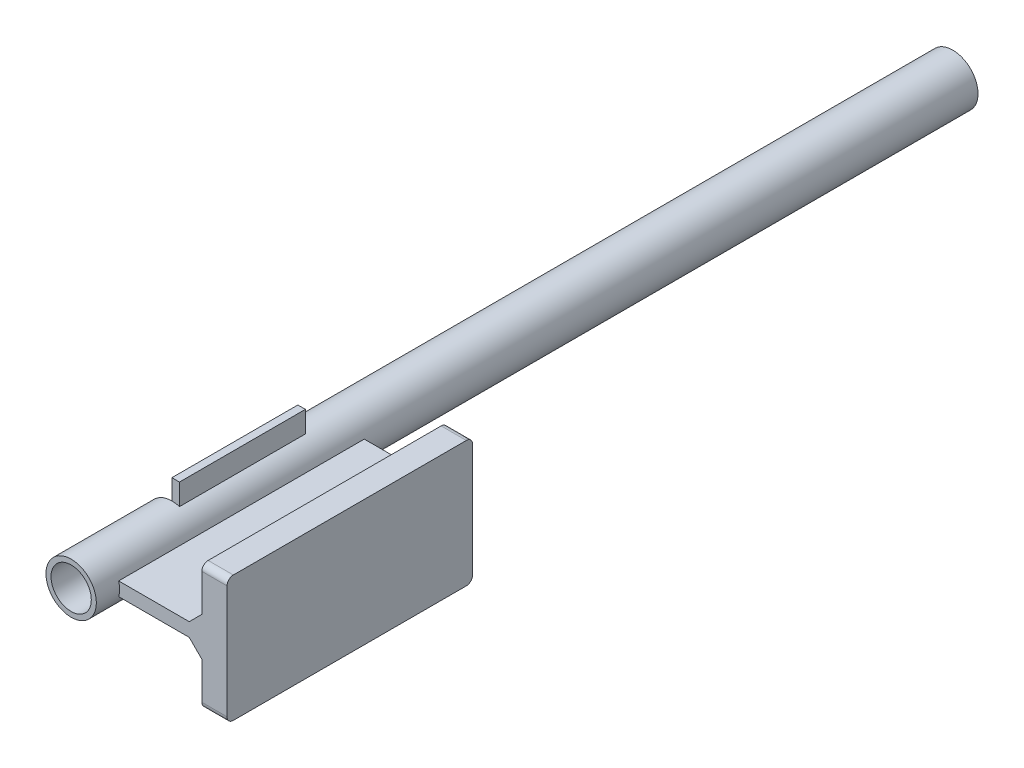
ISO-10303-21;
HEADER;
FILE_DESCRIPTION(('STEP AP214'),'2;1');
FILE_NAME('part.step','',(''),(''),'','','');
FILE_SCHEMA(('AUTOMOTIVE_DESIGN { 1 0 10303 214 1 1 1 1 }'));
ENDSEC;
DATA;
#1=APPLICATION_CONTEXT('core data for automotive mechanical design processes');
#2=APPLICATION_PROTOCOL_DEFINITION('international standard','automotive_design',2000,#1);
#3=PRODUCT_CONTEXT('',#1,'mechanical');
#4=PRODUCT('Part','Part','',(#3));
#5=PRODUCT_RELATED_PRODUCT_CATEGORY('part','',(#4));
#6=PRODUCT_DEFINITION_FORMATION('','',#4);
#7=PRODUCT_DEFINITION_CONTEXT('part definition',#1,'design');
#8=PRODUCT_DEFINITION('design','',#6,#7);
#9=PRODUCT_DEFINITION_SHAPE('','',#8);
#10=(LENGTH_UNIT() NAMED_UNIT(*) SI_UNIT(.MILLI.,.METRE.));
#11=(NAMED_UNIT(*) PLANE_ANGLE_UNIT() SI_UNIT($,.RADIAN.));
#12=(NAMED_UNIT(*) SI_UNIT($,.STERADIAN.) SOLID_ANGLE_UNIT());
#13=UNCERTAINTY_MEASURE_WITH_UNIT(LENGTH_MEASURE(1.E-05),#10,'distance_accuracy_value','');
#14=(GEOMETRIC_REPRESENTATION_CONTEXT(3) GLOBAL_UNCERTAINTY_ASSIGNED_CONTEXT((#13)) GLOBAL_UNIT_ASSIGNED_CONTEXT((#10,
#11,#12)) REPRESENTATION_CONTEXT('',''));
#15=CARTESIAN_POINT('',(0.,0.,0.));
#16=DIRECTION('',(0.,0.,1.));
#17=DIRECTION('',(1.,0.,0.));
#18=AXIS2_PLACEMENT_3D('',#15,#16,#17);
#19=CARTESIAN_POINT('',(0.,0.,350.));
#20=DIRECTION('',(0.,0.,-1.));
#21=DIRECTION('',(-1.,0.,0.));
#22=AXIS2_PLACEMENT_3D('',#19,#20,#21);
#23=CYLINDRICAL_SURFACE('',#22,20.);
#24=CARTESIAN_POINT('',(0.,0.,270.));
#25=DIRECTION('',(0.,0.,1.));
#26=DIRECTION('',(1.,0.,0.));
#27=AXIS2_PLACEMENT_3D('',#24,#25,#26);
#28=CIRCLE('',#27,20.);
#29=CARTESIAN_POINT('',(0.,20.,270.));
#30=VERTEX_POINT('',#29);
#31=CARTESIAN_POINT('',(0.,-20.,270.));
#32=VERTEX_POINT('',#31);
#33=EDGE_CURVE('E341',#30,#32,#28,.T.);
#34=ORIENTED_EDGE('',*,*,#33,.T.);
#35=CARTESIAN_POINT('',(0.,0.,270.));
#36=DIRECTION('',(0.,0.,1.));
#37=DIRECTION('',(1.,0.,0.));
#38=AXIS2_PLACEMENT_3D('',#35,#36,#37);
#39=CIRCLE('',#38,20.);
#40=CARTESIAN_POINT('',(6.,-19.0787840283389,270.));
#41=VERTEX_POINT('',#40);
#42=EDGE_CURVE('E47',#32,#41,#39,.T.);
#43=ORIENTED_EDGE('',*,*,#42,.T.);
#44=DIRECTION('',(0.,0.,-1.));
#45=VECTOR('',#44,1.);
#46=CARTESIAN_POINT('',(6.,-19.0787840283389,350.));
#47=LINE('',#46,#45);
#48=CARTESIAN_POINT('',(6.,-19.0787840283389,170.));
#49=VERTEX_POINT('',#48);
#50=EDGE_CURVE('E11',#49,#41,#47,.F.);
#51=ORIENTED_EDGE('',*,*,#50,.F.);
#52=CARTESIAN_POINT('',(0.,0.,170.));
#53=DIRECTION('',(0.,0.,-1.));
#54=DIRECTION('',(-1.,0.,0.));
#55=AXIS2_PLACEMENT_3D('',#52,#53,#54);
#56=CIRCLE('',#55,20.);
#57=CARTESIAN_POINT('',(0.,-20.,170.));
#58=VERTEX_POINT('',#57);
#59=EDGE_CURVE('E221',#49,#58,#56,.T.);
#60=ORIENTED_EDGE('',*,*,#59,.T.);
#61=CARTESIAN_POINT('',(0.,0.,170.));
#62=DIRECTION('',(0.,0.,-1.));
#63=DIRECTION('',(-1.,0.,0.));
#64=AXIS2_PLACEMENT_3D('',#61,#62,#63);
#65=CIRCLE('',#64,20.);
#66=CARTESIAN_POINT('',(0.,20.,170.));
#67=VERTEX_POINT('',#66);
#68=EDGE_CURVE('E343',#58,#67,#65,.T.);
#69=ORIENTED_EDGE('',*,*,#68,.T.);
#70=CARTESIAN_POINT('',(0.,0.,170.));
#71=DIRECTION('',(0.,0.,-1.));
#72=DIRECTION('',(-1.,0.,0.));
#73=AXIS2_PLACEMENT_3D('',#70,#71,#72);
#74=CIRCLE('',#73,20.);
#75=CARTESIAN_POINT('',(6.,19.0787840283389,170.));
#76=VERTEX_POINT('',#75);
#77=EDGE_CURVE('E268',#67,#76,#74,.T.);
#78=ORIENTED_EDGE('',*,*,#77,.T.);
#79=DIRECTION('',(0.,0.,-1.));
#80=VECTOR('',#79,1.);
#81=CARTESIAN_POINT('',(6.,19.0787840283389,350.));
#82=LINE('',#81,#80);
#83=CARTESIAN_POINT('',(6.,19.0787840283389,270.));
#84=VERTEX_POINT('',#83);
#85=EDGE_CURVE('E40',#84,#76,#82,.T.);
#86=ORIENTED_EDGE('',*,*,#85,.F.);
#87=CARTESIAN_POINT('',(0.,0.,270.));
#88=DIRECTION('',(0.,0.,1.));
#89=DIRECTION('',(1.,0.,0.));
#90=AXIS2_PLACEMENT_3D('',#87,#88,#89);
#91=CIRCLE('',#90,20.);
#92=EDGE_CURVE('E272',#84,#30,#91,.T.);
#93=ORIENTED_EDGE('',*,*,#92,.T.);
#94=EDGE_LOOP('',(#34,#43,#51,#60,#69,#78,#86,#93));
#95=FACE_BOUND('',#94,.T.);
#96=CARTESIAN_POINT('',(0.,0.,-350.));
#97=DIRECTION('',(0.,0.,1.));
#98=DIRECTION('',(1.,0.,0.));
#99=AXIS2_PLACEMENT_3D('',#96,#97,#98);
#100=CIRCLE('',#99,20.);
#101=CARTESIAN_POINT('',(20.,0.,-350.));
#102=VERTEX_POINT('',#101);
#103=EDGE_CURVE('E350',#102,#102,#100,.T.);
#104=ORIENTED_EDGE('',*,*,#103,.T.);
#105=EDGE_LOOP('',(#104));
#106=FACE_BOUND('',#105,.T.);
#107=CARTESIAN_POINT('',(0.,0.,350.));
#108=DIRECTION('',(0.,0.,1.));
#109=DIRECTION('',(1.,0.,0.));
#110=AXIS2_PLACEMENT_3D('',#107,#108,#109);
#111=CIRCLE('',#110,20.);
#112=CARTESIAN_POINT('',(20.,0.,350.));
#113=VERTEX_POINT('',#112);
#114=EDGE_CURVE('E353',#113,#113,#111,.T.);
#115=ORIENTED_EDGE('',*,*,#114,.F.);
#116=EDGE_LOOP('',(#115));
#117=FACE_BOUND('',#116,.T.);
#118=CARTESIAN_POINT('',(0.,0.,331.526227736902));
#119=DIRECTION('',(0.,0.,-1.));
#120=DIRECTION('',(-1.,0.,0.));
#121=AXIS2_PLACEMENT_3D('',#118,#119,#120);
#122=CIRCLE('',#121,20.);
#123=CARTESIAN_POINT('',(19.2547602545811,5.40871588628988,331.526227736902));
#124=VERTEX_POINT('',#123);
#125=CARTESIAN_POINT('',(19.2547602545811,-5.40871588628988,331.526227736902));
#126=VERTEX_POINT('',#125);
#127=EDGE_CURVE('E332',#124,#126,#122,.T.);
#128=ORIENTED_EDGE('',*,*,#127,.F.);
#129=DIRECTION('',(0.,0.,-1.));
#130=VECTOR('',#129,1.);
#131=CARTESIAN_POINT('',(19.2547602545811,5.40871588628988,350.));
#132=LINE('',#131,#130);
#133=CARTESIAN_POINT('',(19.2547602545811,5.40871588628988,136.530924565761));
#134=VERTEX_POINT('',#133);
#135=EDGE_CURVE('E323',#134,#124,#132,.F.);
#136=ORIENTED_EDGE('',*,*,#135,.F.);
#137=CARTESIAN_POINT('',(0.,0.,136.530924565761));
#138=DIRECTION('',(0.,0.,1.));
#139=DIRECTION('',(1.,0.,0.));
#140=AXIS2_PLACEMENT_3D('',#137,#138,#139);
#141=CIRCLE('',#140,20.);
#142=CARTESIAN_POINT('',(19.2547602545811,-5.40871588628988,136.530924565761));
#143=VERTEX_POINT('',#142);
#144=EDGE_CURVE('E326',#143,#134,#141,.T.);
#145=ORIENTED_EDGE('',*,*,#144,.F.);
#146=DIRECTION('',(0.,0.,-1.));
#147=VECTOR('',#146,1.);
#148=CARTESIAN_POINT('',(19.2547602545811,-5.40871588628988,350.));
#149=LINE('',#148,#147);
#150=EDGE_CURVE('E329',#126,#143,#149,.T.);
#151=ORIENTED_EDGE('',*,*,#150,.F.);
#152=EDGE_LOOP('',(#128,#136,#145,#151));
#153=FACE_BOUND('',#152,.T.);
#154=ADVANCED_FACE('F32',(#95,#106,#117,#153),#23,.T.);
#155=CARTESIAN_POINT('',(0.,0.,350.));
#156=DIRECTION('',(0.,0.,-1.));
#157=DIRECTION('',(-1.,0.,0.));
#158=AXIS2_PLACEMENT_3D('',#155,#156,#157);
#159=CYLINDRICAL_SURFACE('',#158,16.);
#160=CARTESIAN_POINT('',(0.,0.,170.));
#161=DIRECTION('',(0.,0.,-1.));
#162=DIRECTION('',(-1.,0.,0.));
#163=AXIS2_PLACEMENT_3D('',#160,#161,#162);
#164=CIRCLE('',#163,16.);
#165=CARTESIAN_POINT('',(0.,-16.,170.));
#166=VERTEX_POINT('',#165);
#167=CARTESIAN_POINT('',(0.,16.,170.));
#168=VERTEX_POINT('',#167);
#169=EDGE_CURVE('E365',#166,#168,#164,.T.);
#170=ORIENTED_EDGE('',*,*,#169,.F.);
#171=DIRECTION('',(0.,0.,-1.));
#172=VECTOR('',#171,1.);
#173=CARTESIAN_POINT('',(0.,-16.,350.));
#174=LINE('',#173,#172);
#175=CARTESIAN_POINT('',(0.,-16.,270.));
#176=VERTEX_POINT('',#175);
#177=EDGE_CURVE('E363',#176,#166,#174,.T.);
#178=ORIENTED_EDGE('',*,*,#177,.F.);
#179=CARTESIAN_POINT('',(0.,0.,270.));
#180=DIRECTION('',(0.,0.,1.));
#181=DIRECTION('',(1.,0.,0.));
#182=AXIS2_PLACEMENT_3D('',#179,#180,#181);
#183=CIRCLE('',#182,16.);
#184=CARTESIAN_POINT('',(0.,16.,270.));
#185=VERTEX_POINT('',#184);
#186=EDGE_CURVE('E356',#185,#176,#183,.T.);
#187=ORIENTED_EDGE('',*,*,#186,.F.);
#188=DIRECTION('',(0.,0.,-1.));
#189=VECTOR('',#188,1.);
#190=CARTESIAN_POINT('',(0.,16.,350.));
#191=LINE('',#190,#189);
#192=EDGE_CURVE('E360',#168,#185,#191,.F.);
#193=ORIENTED_EDGE('',*,*,#192,.F.);
#194=EDGE_LOOP('',(#170,#178,#187,#193));
#195=FACE_BOUND('',#194,.T.);
#196=CARTESIAN_POINT('',(0.,0.,350.));
#197=DIRECTION('',(0.,0.,1.));
#198=DIRECTION('',(1.,0.,0.));
#199=AXIS2_PLACEMENT_3D('',#196,#197,#198);
#200=CIRCLE('',#199,16.);
#201=CARTESIAN_POINT('',(16.,0.,350.));
#202=VERTEX_POINT('',#201);
#203=EDGE_CURVE('E347',#202,#202,#200,.T.);
#204=ORIENTED_EDGE('',*,*,#203,.T.);
#205=EDGE_LOOP('',(#204));
#206=FACE_BOUND('',#205,.T.);
#207=CARTESIAN_POINT('',(0.,0.,-350.));
#208=DIRECTION('',(0.,0.,1.));
#209=DIRECTION('',(1.,0.,0.));
#210=AXIS2_PLACEMENT_3D('',#207,#208,#209);
#211=CIRCLE('',#210,16.);
#212=CARTESIAN_POINT('',(16.,0.,-350.));
#213=VERTEX_POINT('',#212);
#214=EDGE_CURVE('E346',#213,#213,#211,.T.);
#215=ORIENTED_EDGE('',*,*,#214,.F.);
#216=EDGE_LOOP('',(#215));
#217=FACE_BOUND('',#216,.T.);
#218=DIRECTION('',(0.,0.,-1.));
#219=VECTOR('',#218,1.);
#220=CARTESIAN_POINT('',(15.0580806367012,5.40871588628988,350.));
#221=LINE('',#220,#219);
#222=CARTESIAN_POINT('',(15.0580806367012,5.40871588628988,136.530924565761));
#223=VERTEX_POINT('',#222);
#224=CARTESIAN_POINT('',(15.0580806367012,5.40871588628988,331.526227736902));
#225=VERTEX_POINT('',#224);
#226=EDGE_CURVE('E367',#223,#225,#221,.F.);
#227=ORIENTED_EDGE('',*,*,#226,.T.);
#228=CARTESIAN_POINT('',(0.,0.,331.526227736902));
#229=DIRECTION('',(0.,0.,-1.));
#230=DIRECTION('',(-1.,0.,0.));
#231=AXIS2_PLACEMENT_3D('',#228,#229,#230);
#232=CIRCLE('',#231,16.);
#233=CARTESIAN_POINT('',(15.0580806367012,-5.40871588628988,331.526227736902));
#234=VERTEX_POINT('',#233);
#235=EDGE_CURVE('E376',#225,#234,#232,.T.);
#236=ORIENTED_EDGE('',*,*,#235,.T.);
#237=DIRECTION('',(0.,0.,-1.));
#238=VECTOR('',#237,1.);
#239=CARTESIAN_POINT('',(15.0580806367012,-5.40871588628988,350.));
#240=LINE('',#239,#238);
#241=CARTESIAN_POINT('',(15.0580806367012,-5.40871588628988,136.530924565761));
#242=VERTEX_POINT('',#241);
#243=EDGE_CURVE('E373',#234,#242,#240,.T.);
#244=ORIENTED_EDGE('',*,*,#243,.T.);
#245=CARTESIAN_POINT('',(0.,0.,136.530924565761));
#246=DIRECTION('',(0.,0.,1.));
#247=DIRECTION('',(1.,0.,0.));
#248=AXIS2_PLACEMENT_3D('',#245,#246,#247);
#249=CIRCLE('',#248,16.);
#250=EDGE_CURVE('E370',#242,#223,#249,.T.);
#251=ORIENTED_EDGE('',*,*,#250,.T.);
#252=EDGE_LOOP('',(#227,#236,#244,#251));
#253=FACE_BOUND('',#252,.T.);
#254=ADVANCED_FACE('F473',(#195,#206,#217,#253),#159,.F.);
#255=CARTESIAN_POINT('',(0.,0.,350.));
#256=DIRECTION('',(0.,0.,1.));
#257=DIRECTION('',(1.,0.,0.));
#258=AXIS2_PLACEMENT_3D('',#255,#256,#257);
#259=PLANE('',#258);
#260=ORIENTED_EDGE('',*,*,#114,.T.);
#261=EDGE_LOOP('',(#260));
#262=FACE_BOUND('',#261,.T.);
#263=ORIENTED_EDGE('',*,*,#203,.F.);
#264=EDGE_LOOP('',(#263));
#265=FACE_BOUND('',#264,.T.);
#266=ADVANCED_FACE('F493',(#262,#265),#259,.T.);
#267=CARTESIAN_POINT('',(0.,0.,-350.));
#268=DIRECTION('',(0.,0.,1.));
#269=DIRECTION('',(1.,0.,0.));
#270=AXIS2_PLACEMENT_3D('',#267,#268,#269);
#271=PLANE('',#270);
#272=ORIENTED_EDGE('',*,*,#103,.F.);
#273=EDGE_LOOP('',(#272));
#274=FACE_BOUND('',#273,.T.);
#275=ORIENTED_EDGE('',*,*,#214,.T.);
#276=EDGE_LOOP('',(#275));
#277=FACE_BOUND('',#276,.T.);
#278=ADVANCED_FACE('F496',(#274,#277),#271,.F.);
#279=CARTESIAN_POINT('',(-46.7025361808737,-100.,170.));
#280=DIRECTION('',(0.,0.,-1.));
#281=DIRECTION('',(-1.,0.,0.));
#282=AXIS2_PLACEMENT_3D('',#279,#280,#281);
#283=PLANE('',#282);
#284=DIRECTION('',(0.,1.,0.));
#285=VECTOR('',#284,1.);
#286=CARTESIAN_POINT('',(0.,-100.,170.));
#287=LINE('',#286,#285);
#288=EDGE_CURVE('E338',#58,#166,#287,.T.);
#289=ORIENTED_EDGE('',*,*,#288,.T.);
#290=ORIENTED_EDGE('',*,*,#169,.T.);
#291=EDGE_CURVE('E336',#168,#67,#287,.T.);
#292=ORIENTED_EDGE('',*,*,#291,.T.);
#293=ORIENTED_EDGE('',*,*,#68,.F.);
#294=EDGE_LOOP('',(#289,#290,#292,#293));
#295=FACE_BOUND('',#294,.T.);
#296=ADVANCED_FACE('F466',(#295),#283,.F.);
#297=CARTESIAN_POINT('',(0.,-100.,270.));
#298=DIRECTION('',(1.,0.,0.));
#299=DIRECTION('',(0.,0.,-1.));
#300=AXIS2_PLACEMENT_3D('',#297,#298,#299);
#301=PLANE('',#300);
#302=DIRECTION('',(0.,1.,0.));
#303=VECTOR('',#302,1.);
#304=CARTESIAN_POINT('',(0.,-100.,270.));
#305=LINE('',#304,#303);
#306=EDGE_CURVE('E339',#32,#176,#305,.T.);
#307=ORIENTED_EDGE('',*,*,#306,.T.);
#308=ORIENTED_EDGE('',*,*,#177,.T.);
#309=ORIENTED_EDGE('',*,*,#288,.F.);
#310=DIRECTION('',(0.,-1.,0.));
#311=VECTOR('',#310,1.);
#312=CARTESIAN_POINT('',(0.,-16.,170.));
#313=LINE('',#312,#311);
#314=CARTESIAN_POINT('',(0.,-36.,170.));
#315=VERTEX_POINT('',#314);
#316=EDGE_CURVE('E241',#58,#315,#313,.T.);
#317=ORIENTED_EDGE('',*,*,#316,.T.);
#318=DIRECTION('',(0.,0.,1.));
#319=VECTOR('',#318,1.);
#320=CARTESIAN_POINT('',(0.,-36.,270.));
#321=LINE('',#320,#319);
#322=CARTESIAN_POINT('',(0.,-36.,270.));
#323=VERTEX_POINT('',#322);
#324=EDGE_CURVE('E232',#315,#323,#321,.T.);
#325=ORIENTED_EDGE('',*,*,#324,.T.);
#326=DIRECTION('',(0.,1.,0.));
#327=VECTOR('',#326,1.);
#328=CARTESIAN_POINT('',(0.,-16.,270.));
#329=LINE('',#328,#327);
#330=EDGE_CURVE('E225',#323,#32,#329,.T.);
#331=ORIENTED_EDGE('',*,*,#330,.T.);
#332=EDGE_LOOP('',(#307,#308,#309,#317,#325,#331));
#333=FACE_BOUND('',#332,.T.);
#334=ADVANCED_FACE('F460',(#333),#301,.F.);
#335=ORIENTED_EDGE('',*,*,#291,.F.);
#336=ORIENTED_EDGE('',*,*,#192,.T.);
#337=EDGE_CURVE('E335',#185,#30,#305,.T.);
#338=ORIENTED_EDGE('',*,*,#337,.T.);
#339=DIRECTION('',(0.,1.,0.));
#340=VECTOR('',#339,1.);
#341=CARTESIAN_POINT('',(0.,16.,270.));
#342=LINE('',#341,#340);
#343=CARTESIAN_POINT('',(0.,36.,270.));
#344=VERTEX_POINT('',#343);
#345=EDGE_CURVE('E249',#30,#344,#342,.T.);
#346=ORIENTED_EDGE('',*,*,#345,.T.);
#347=DIRECTION('',(0.,0.,-1.));
#348=VECTOR('',#347,1.);
#349=CARTESIAN_POINT('',(0.,36.,270.));
#350=LINE('',#349,#348);
#351=CARTESIAN_POINT('',(0.,36.,170.));
#352=VERTEX_POINT('',#351);
#353=EDGE_CURVE('E261',#344,#352,#350,.T.);
#354=ORIENTED_EDGE('',*,*,#353,.T.);
#355=DIRECTION('',(0.,-1.,0.));
#356=VECTOR('',#355,1.);
#357=CARTESIAN_POINT('',(0.,16.,170.));
#358=LINE('',#357,#356);
#359=EDGE_CURVE('E253',#352,#67,#358,.T.);
#360=ORIENTED_EDGE('',*,*,#359,.T.);
#361=EDGE_LOOP('',(#335,#336,#338,#346,#354,#360));
#362=FACE_BOUND('',#361,.T.);
#363=ADVANCED_FACE('F470',(#362),#301,.F.);
#364=CARTESIAN_POINT('',(-46.7025361808737,-100.,270.));
#365=DIRECTION('',(0.,0.,1.));
#366=DIRECTION('',(1.,0.,0.));
#367=AXIS2_PLACEMENT_3D('',#364,#365,#366);
#368=PLANE('',#367);
#369=ORIENTED_EDGE('',*,*,#337,.F.);
#370=ORIENTED_EDGE('',*,*,#186,.T.);
#371=ORIENTED_EDGE('',*,*,#306,.F.);
#372=ORIENTED_EDGE('',*,*,#33,.F.);
#373=EDGE_LOOP('',(#369,#370,#371,#372));
#374=FACE_BOUND('',#373,.T.);
#375=ADVANCED_FACE('F475',(#374),#368,.F.);
#376=CARTESIAN_POINT('',(0.,0.,0.));
#377=DIRECTION('',(-1.,0.,0.));
#378=DIRECTION('',(0.,0.,1.));
#379=AXIS2_PLACEMENT_3D('',#376,#377,#378);
#380=PLANE('',#379);
#381=DIRECTION('',(0.,-1.,0.));
#382=VECTOR('',#381,1.);
#383=CARTESIAN_POINT('',(0.,-5.40871588628988,331.526227736902));
#384=LINE('',#383,#382);
#385=CARTESIAN_POINT('',(0.,5.40871588628988,331.526227736902));
#386=VERTEX_POINT('',#385);
#387=CARTESIAN_POINT('',(0.,-5.40871588628988,331.526227736902));
#388=VERTEX_POINT('',#387);
#389=EDGE_CURVE('E288',#386,#388,#384,.T.);
#390=ORIENTED_EDGE('',*,*,#389,.F.);
#391=DIRECTION('',(0.,0.,1.));
#392=VECTOR('',#391,1.);
#393=CARTESIAN_POINT('',(0.,5.40871588628988,331.526227736902));
#394=LINE('',#393,#392);
#395=CARTESIAN_POINT('',(0.,5.40871588628988,136.530924565761));
#396=VERTEX_POINT('',#395);
#397=EDGE_CURVE('E298',#396,#386,#394,.T.);
#398=ORIENTED_EDGE('',*,*,#397,.F.);
#399=DIRECTION('',(0.,1.,0.));
#400=VECTOR('',#399,1.);
#401=CARTESIAN_POINT('',(0.,-5.40871588628988,136.530924565761));
#402=LINE('',#401,#400);
#403=CARTESIAN_POINT('',(0.,-5.40871588628988,136.530924565761));
#404=VERTEX_POINT('',#403);
#405=EDGE_CURVE('E307',#404,#396,#402,.T.);
#406=ORIENTED_EDGE('',*,*,#405,.F.);
#407=DIRECTION('',(0.,0.,-1.));
#408=VECTOR('',#407,1.);
#409=CARTESIAN_POINT('',(0.,-5.40871588628988,331.526227736902));
#410=LINE('',#409,#408);
#411=EDGE_CURVE('E304',#388,#404,#410,.T.);
#412=ORIENTED_EDGE('',*,*,#411,.F.);
#413=EDGE_LOOP('',(#390,#398,#406,#412));
#414=FACE_BOUND('',#413,.T.);
#415=ADVANCED_FACE('F477',(#414),#380,.T.);
#416=CARTESIAN_POINT('',(105.29,5.40871588628988,331.526227736902));
#417=DIRECTION('',(0.,-1.,0.));
#418=DIRECTION('',(0.,0.,-1.));
#419=AXIS2_PLACEMENT_3D('',#416,#417,#418);
#420=PLANE('',#419);
#421=ORIENTED_EDGE('',*,*,#226,.F.);
#422=DIRECTION('',(-1.,0.,0.));
#423=VECTOR('',#422,1.);
#424=CARTESIAN_POINT('',(105.29,5.40871588628988,136.530924565761));
#425=LINE('',#424,#423);
#426=EDGE_CURVE('E314',#223,#396,#425,.T.);
#427=ORIENTED_EDGE('',*,*,#426,.T.);
#428=ORIENTED_EDGE('',*,*,#397,.T.);
#429=DIRECTION('',(-1.,0.,0.));
#430=VECTOR('',#429,1.);
#431=CARTESIAN_POINT('',(105.29,5.40871588628988,331.526227736902));
#432=LINE('',#431,#430);
#433=EDGE_CURVE('E301',#225,#386,#432,.T.);
#434=ORIENTED_EDGE('',*,*,#433,.F.);
#435=EDGE_LOOP('',(#421,#427,#428,#434));
#436=FACE_BOUND('',#435,.T.);
#437=ADVANCED_FACE('F483',(#436),#420,.F.);
#438=CARTESIAN_POINT('',(105.29,-5.40871588628988,136.530924565761));
#439=DIRECTION('',(0.,0.,1.));
#440=DIRECTION('',(1.,0.,0.));
#441=AXIS2_PLACEMENT_3D('',#438,#439,#440);
#442=PLANE('',#441);
#443=ORIENTED_EDGE('',*,*,#250,.F.);
#444=DIRECTION('',(-1.,0.,0.));
#445=VECTOR('',#444,1.);
#446=CARTESIAN_POINT('',(105.29,-5.40871588628988,136.530924565761));
#447=LINE('',#446,#445);
#448=EDGE_CURVE('E317',#242,#404,#447,.T.);
#449=ORIENTED_EDGE('',*,*,#448,.T.);
#450=ORIENTED_EDGE('',*,*,#405,.T.);
#451=ORIENTED_EDGE('',*,*,#426,.F.);
#452=EDGE_LOOP('',(#443,#449,#450,#451));
#453=FACE_BOUND('',#452,.T.);
#454=ADVANCED_FACE('F589',(#453),#442,.F.);
#455=CARTESIAN_POINT('',(105.29,-5.40871588628988,331.526227736902));
#456=DIRECTION('',(0.,1.,0.));
#457=DIRECTION('',(0.,0.,1.));
#458=AXIS2_PLACEMENT_3D('',#455,#456,#457);
#459=PLANE('',#458);
#460=ORIENTED_EDGE('',*,*,#243,.F.);
#461=DIRECTION('',(-1.,0.,0.));
#462=VECTOR('',#461,1.);
#463=CARTESIAN_POINT('',(105.29,-5.40871588628988,331.526227736902));
#464=LINE('',#463,#462);
#465=EDGE_CURVE('E320',#234,#388,#464,.T.);
#466=ORIENTED_EDGE('',*,*,#465,.T.);
#467=ORIENTED_EDGE('',*,*,#411,.T.);
#468=ORIENTED_EDGE('',*,*,#448,.F.);
#469=EDGE_LOOP('',(#460,#466,#467,#468));
#470=FACE_BOUND('',#469,.T.);
#471=ADVANCED_FACE('F593',(#470),#459,.F.);
#472=CARTESIAN_POINT('',(105.29,-5.40871588628988,331.526227736902));
#473=DIRECTION('',(0.,0.,-1.));
#474=DIRECTION('',(-1.,0.,0.));
#475=AXIS2_PLACEMENT_3D('',#472,#473,#474);
#476=PLANE('',#475);
#477=ORIENTED_EDGE('',*,*,#235,.F.);
#478=ORIENTED_EDGE('',*,*,#433,.T.);
#479=ORIENTED_EDGE('',*,*,#389,.T.);
#480=ORIENTED_EDGE('',*,*,#465,.F.);
#481=EDGE_LOOP('',(#477,#478,#479,#480));
#482=FACE_BOUND('',#481,.T.);
#483=ADVANCED_FACE('F596',(#482),#476,.F.);
#484=CARTESIAN_POINT('',(75.29,-5.40871588628988,136.530924565761));
#485=VERTEX_POINT('',#484);
#486=EDGE_CURVE('E318',#485,#143,#447,.T.);
#487=ORIENTED_EDGE('',*,*,#486,.F.);
#488=DIRECTION('',(0.,0.,1.));
#489=VECTOR('',#488,1.);
#490=CARTESIAN_POINT('',(75.29,-5.40871588628988,331.526227736902));
#491=LINE('',#490,#489);
#492=CARTESIAN_POINT('',(75.29,-5.40871588628988,331.526227736902));
#493=VERTEX_POINT('',#492);
#494=EDGE_CURVE('E379',#485,#493,#491,.T.);
#495=ORIENTED_EDGE('',*,*,#494,.T.);
#496=EDGE_CURVE('E321',#493,#126,#464,.T.);
#497=ORIENTED_EDGE('',*,*,#496,.T.);
#498=ORIENTED_EDGE('',*,*,#150,.T.);
#499=EDGE_LOOP('',(#487,#495,#497,#498));
#500=FACE_BOUND('',#499,.T.);
#501=ADVANCED_FACE('F550',(#500),#459,.F.);
#502=CARTESIAN_POINT('',(75.29,5.40871588628988,331.526227736902));
#503=VERTEX_POINT('',#502);
#504=EDGE_CURVE('E312',#503,#124,#432,.T.);
#505=ORIENTED_EDGE('',*,*,#504,.F.);
#506=DIRECTION('',(0.,0.,-1.));
#507=VECTOR('',#506,1.);
#508=CARTESIAN_POINT('',(75.29,5.40871588628988,331.526227736902));
#509=LINE('',#508,#507);
#510=CARTESIAN_POINT('',(75.29,5.40871588628988,136.530924565761));
#511=VERTEX_POINT('',#510);
#512=EDGE_CURVE('E385',#503,#511,#509,.T.);
#513=ORIENTED_EDGE('',*,*,#512,.T.);
#514=EDGE_CURVE('E315',#511,#134,#425,.T.);
#515=ORIENTED_EDGE('',*,*,#514,.T.);
#516=ORIENTED_EDGE('',*,*,#135,.T.);
#517=EDGE_LOOP('',(#505,#513,#515,#516));
#518=FACE_BOUND('',#517,.T.);
#519=ADVANCED_FACE('F538',(#518),#420,.F.);
#520=DIRECTION('',(0.,-1.,0.));
#521=VECTOR('',#520,1.);
#522=CARTESIAN_POINT('',(85.2900000000002,50.,331.526227736902));
#523=LINE('',#522,#521);
#524=CARTESIAN_POINT('',(85.2900000000002,-15.4087158862899,331.526227736902));
#525=VERTEX_POINT('',#524);
#526=CARTESIAN_POINT('',(85.2900000000002,-45.,331.526227736902));
#527=VERTEX_POINT('',#526);
#528=EDGE_CURVE('E282',#525,#527,#523,.T.);
#529=ORIENTED_EDGE('',*,*,#528,.T.);
#530=DIRECTION('',(1.,0.,0.));
#531=VECTOR('',#530,1.);
#532=CARTESIAN_POINT('',(105.29,-45.,331.526227736902));
#533=LINE('',#532,#531);
#534=CARTESIAN_POINT('',(105.29,-45.,331.526227736902));
#535=VERTEX_POINT('',#534);
#536=EDGE_CURVE('E401',#527,#535,#533,.T.);
#537=ORIENTED_EDGE('',*,*,#536,.T.);
#538=DIRECTION('',(0.,-1.,0.));
#539=VECTOR('',#538,1.);
#540=CARTESIAN_POINT('',(105.29,-5.40871588628988,331.526227736902));
#541=LINE('',#540,#539);
#542=CARTESIAN_POINT('',(105.29,45.,331.526227736902));
#543=VERTEX_POINT('',#542);
#544=EDGE_CURVE('E294',#543,#535,#541,.T.);
#545=ORIENTED_EDGE('',*,*,#544,.F.);
#546=DIRECTION('',(1.,0.,0.));
#547=VECTOR('',#546,1.);
#548=CARTESIAN_POINT('',(85.2900000000002,45.,331.526227736902));
#549=LINE('',#548,#547);
#550=CARTESIAN_POINT('',(85.2900000000002,45.,331.526227736902));
#551=VERTEX_POINT('',#550);
#552=EDGE_CURVE('E399',#543,#551,#549,.F.);
#553=ORIENTED_EDGE('',*,*,#552,.T.);
#554=CARTESIAN_POINT('',(85.2900000000002,15.4087158862899,331.526227736902));
#555=VERTEX_POINT('',#554);
#556=EDGE_CURVE('E283',#551,#555,#523,.T.);
#557=ORIENTED_EDGE('',*,*,#556,.T.);
#558=DIRECTION('',(-0.707106781186551,-0.707106781186544,0.));
#559=VECTOR('',#558,1.);
#560=CARTESIAN_POINT('',(84.8812841137104,15.0000000000001,331.526227736902));
#561=LINE('',#560,#559);
#562=EDGE_CURVE('E397',#555,#503,#561,.T.);
#563=ORIENTED_EDGE('',*,*,#562,.T.);
#564=ORIENTED_EDGE('',*,*,#504,.T.);
#565=ORIENTED_EDGE('',*,*,#127,.T.);
#566=ORIENTED_EDGE('',*,*,#496,.F.);
#567=DIRECTION('',(0.707106781186551,-0.707106781186544,0.));
#568=VECTOR('',#567,1.);
#569=CARTESIAN_POINT('',(90.2900000000003,-20.4087158862899,331.526227736902));
#570=LINE('',#569,#568);
#571=EDGE_CURVE('E391',#493,#525,#570,.T.);
#572=ORIENTED_EDGE('',*,*,#571,.T.);
#573=EDGE_LOOP('',(#529,#537,#545,#553,#557,#563,#564,#565,#566,#572));
#574=FACE_BOUND('',#573,.T.);
#575=ADVANCED_FACE('F543',(#574),#476,.F.);
#576=DIRECTION('',(0.,1.,0.));
#577=VECTOR('',#576,1.);
#578=CARTESIAN_POINT('',(105.29,-5.40871588628988,136.530924565761));
#579=LINE('',#578,#577);
#580=CARTESIAN_POINT('',(105.29,-45.,136.530924565761));
#581=VERTEX_POINT('',#580);
#582=CARTESIAN_POINT('',(105.29,45.,136.530924565761));
#583=VERTEX_POINT('',#582);
#584=EDGE_CURVE('E297',#581,#583,#579,.T.);
#585=ORIENTED_EDGE('',*,*,#584,.F.);
#586=DIRECTION('',(1.,0.,0.));
#587=VECTOR('',#586,1.);
#588=CARTESIAN_POINT('',(85.2900000000002,-45.,136.530924565761));
#589=LINE('',#588,#587);
#590=CARTESIAN_POINT('',(85.2900000000002,-45.,136.530924565761));
#591=VERTEX_POINT('',#590);
#592=EDGE_CURVE('E424',#581,#591,#589,.F.);
#593=ORIENTED_EDGE('',*,*,#592,.T.);
#594=DIRECTION('',(0.,1.,0.));
#595=VECTOR('',#594,1.);
#596=CARTESIAN_POINT('',(85.2900000000002,50.,136.530924565761));
#597=LINE('',#596,#595);
#598=CARTESIAN_POINT('',(85.2900000000002,-15.4087158862899,136.530924565761));
#599=VERTEX_POINT('',#598);
#600=EDGE_CURVE('E276',#591,#599,#597,.T.);
#601=ORIENTED_EDGE('',*,*,#600,.T.);
#602=DIRECTION('',(-0.707106781186551,0.707106781186544,0.));
#603=VECTOR('',#602,1.);
#604=CARTESIAN_POINT('',(90.2900000000003,-20.4087158862899,136.530924565761));
#605=LINE('',#604,#603);
#606=EDGE_CURVE('E393',#599,#485,#605,.T.);
#607=ORIENTED_EDGE('',*,*,#606,.T.);
#608=ORIENTED_EDGE('',*,*,#486,.T.);
#609=ORIENTED_EDGE('',*,*,#144,.T.);
#610=ORIENTED_EDGE('',*,*,#514,.F.);
#611=DIRECTION('',(0.707106781186551,0.707106781186544,0.));
#612=VECTOR('',#611,1.);
#613=CARTESIAN_POINT('',(84.8812841137104,15.0000000000001,136.530924565761));
#614=LINE('',#613,#612);
#615=CARTESIAN_POINT('',(85.2900000000002,15.4087158862899,136.530924565761));
#616=VERTEX_POINT('',#615);
#617=EDGE_CURVE('E395',#511,#616,#614,.T.);
#618=ORIENTED_EDGE('',*,*,#617,.T.);
#619=CARTESIAN_POINT('',(85.2900000000002,45.,136.530924565761));
#620=VERTEX_POINT('',#619);
#621=EDGE_CURVE('E279',#616,#620,#597,.T.);
#622=ORIENTED_EDGE('',*,*,#621,.T.);
#623=DIRECTION('',(1.,0.,0.));
#624=VECTOR('',#623,1.);
#625=CARTESIAN_POINT('',(105.29,45.,136.530924565761));
#626=LINE('',#625,#624);
#627=EDGE_CURVE('E421',#620,#583,#626,.T.);
#628=ORIENTED_EDGE('',*,*,#627,.T.);
#629=EDGE_LOOP('',(#585,#593,#601,#607,#608,#609,#610,#618,#622,#628));
#630=FACE_BOUND('',#629,.T.);
#631=ADVANCED_FACE('F532',(#630),#442,.F.);
#632=CARTESIAN_POINT('',(105.29,0.,0.));
#633=DIRECTION('',(-1.,0.,0.));
#634=DIRECTION('',(0.,0.,1.));
#635=AXIS2_PLACEMENT_3D('',#632,#633,#634);
#636=PLANE('',#635);
#637=ORIENTED_EDGE('',*,*,#544,.T.);
#638=CARTESIAN_POINT('',(105.29,-45.,326.526227736902));
#639=DIRECTION('',(-1.,0.,0.));
#640=DIRECTION('',(0.,0.,1.));
#641=AXIS2_PLACEMENT_3D('',#638,#639,#640);
#642=CIRCLE('',#641,5.);
#643=CARTESIAN_POINT('',(105.29,-50.,326.526227736902));
#644=VERTEX_POINT('',#643);
#645=EDGE_CURVE('E410',#535,#644,#642,.F.);
#646=ORIENTED_EDGE('',*,*,#645,.T.);
#647=DIRECTION('',(0.,0.,-1.));
#648=VECTOR('',#647,1.);
#649=CARTESIAN_POINT('',(105.29,-50.,136.530924565761));
#650=LINE('',#649,#648);
#651=CARTESIAN_POINT('',(105.29,-50.,141.530924565761));
#652=VERTEX_POINT('',#651);
#653=EDGE_CURVE('E291',#644,#652,#650,.T.);
#654=ORIENTED_EDGE('',*,*,#653,.T.);
#655=CARTESIAN_POINT('',(105.29,-45.,141.530924565761));
#656=DIRECTION('',(-1.,0.,0.));
#657=DIRECTION('',(0.,0.,1.));
#658=AXIS2_PLACEMENT_3D('',#655,#656,#657);
#659=CIRCLE('',#658,5.);
#660=EDGE_CURVE('E408',#652,#581,#659,.F.);
#661=ORIENTED_EDGE('',*,*,#660,.T.);
#662=ORIENTED_EDGE('',*,*,#584,.T.);
#663=CARTESIAN_POINT('',(105.29,45.,141.530924565761));
#664=DIRECTION('',(-1.,0.,0.));
#665=DIRECTION('',(0.,0.,1.));
#666=AXIS2_PLACEMENT_3D('',#663,#664,#665);
#667=CIRCLE('',#666,5.);
#668=CARTESIAN_POINT('',(105.29,50.,141.530924565761));
#669=VERTEX_POINT('',#668);
#670=EDGE_CURVE('E406',#583,#669,#667,.F.);
#671=ORIENTED_EDGE('',*,*,#670,.T.);
#672=DIRECTION('',(0.,0.,1.));
#673=VECTOR('',#672,1.);
#674=CARTESIAN_POINT('',(105.29,50.,136.530924565761));
#675=LINE('',#674,#673);
#676=CARTESIAN_POINT('',(105.29,50.,326.526227736902));
#677=VERTEX_POINT('',#676);
#678=EDGE_CURVE('E275',#669,#677,#675,.T.);
#679=ORIENTED_EDGE('',*,*,#678,.T.);
#680=CARTESIAN_POINT('',(105.29,45.,326.526227736902));
#681=DIRECTION('',(-1.,0.,0.));
#682=DIRECTION('',(0.,0.,1.));
#683=AXIS2_PLACEMENT_3D('',#680,#681,#682);
#684=CIRCLE('',#683,5.);
#685=EDGE_CURVE('E404',#677,#543,#684,.F.);
#686=ORIENTED_EDGE('',*,*,#685,.T.);
#687=EDGE_LOOP('',(#637,#646,#654,#661,#662,#671,#679,#686));
#688=FACE_BOUND('',#687,.T.);
#689=ADVANCED_FACE('F568',(#688),#636,.F.);
#690=CARTESIAN_POINT('',(85.2900000000002,50.,136.530924565761));
#691=DIRECTION('',(0.,1.,0.));
#692=DIRECTION('',(0.,0.,1.));
#693=AXIS2_PLACEMENT_3D('',#690,#691,#692);
#694=PLANE('',#693);
#695=ORIENTED_EDGE('',*,*,#678,.F.);
#696=DIRECTION('',(1.,0.,0.));
#697=VECTOR('',#696,1.);
#698=CARTESIAN_POINT('',(85.2900000000002,50.,141.530924565761));
#699=LINE('',#698,#697);
#700=CARTESIAN_POINT('',(85.2900000000002,50.,141.530924565761));
#701=VERTEX_POINT('',#700);
#702=EDGE_CURVE('E429',#669,#701,#699,.F.);
#703=ORIENTED_EDGE('',*,*,#702,.T.);
#704=DIRECTION('',(0.,0.,1.));
#705=VECTOR('',#704,1.);
#706=CARTESIAN_POINT('',(85.2900000000002,50.,136.530924565761));
#707=LINE('',#706,#705);
#708=CARTESIAN_POINT('',(85.2900000000002,50.,326.526227736902));
#709=VERTEX_POINT('',#708);
#710=EDGE_CURVE('E278',#701,#709,#707,.T.);
#711=ORIENTED_EDGE('',*,*,#710,.T.);
#712=DIRECTION('',(1.,0.,0.));
#713=VECTOR('',#712,1.);
#714=CARTESIAN_POINT('',(105.29,50.,326.526227736902));
#715=LINE('',#714,#713);
#716=EDGE_CURVE('E426',#709,#677,#715,.T.);
#717=ORIENTED_EDGE('',*,*,#716,.T.);
#718=EDGE_LOOP('',(#695,#703,#711,#717));
#719=FACE_BOUND('',#718,.T.);
#720=ADVANCED_FACE('F576',(#719),#694,.T.);
#721=CARTESIAN_POINT('',(85.2900000000002,0.,0.));
#722=DIRECTION('',(-1.,0.,0.));
#723=DIRECTION('',(0.,0.,1.));
#724=AXIS2_PLACEMENT_3D('',#721,#722,#723);
#725=PLANE('',#724);
#726=ORIENTED_EDGE('',*,*,#710,.F.);
#727=CARTESIAN_POINT('',(85.2900000000002,45.,141.530924565761));
#728=DIRECTION('',(-1.,0.,0.));
#729=DIRECTION('',(0.,0.,1.));
#730=AXIS2_PLACEMENT_3D('',#727,#728,#729);
#731=CIRCLE('',#730,5.);
#732=EDGE_CURVE('E433',#701,#620,#731,.T.);
#733=ORIENTED_EDGE('',*,*,#732,.T.);
#734=ORIENTED_EDGE('',*,*,#621,.F.);
#735=DIRECTION('',(0.,0.,1.));
#736=VECTOR('',#735,1.);
#737=CARTESIAN_POINT('',(85.2900000000002,15.4087158862899,0.));
#738=LINE('',#737,#736);
#739=EDGE_CURVE('E388',#616,#555,#738,.T.);
#740=ORIENTED_EDGE('',*,*,#739,.T.);
#741=ORIENTED_EDGE('',*,*,#556,.F.);
#742=CARTESIAN_POINT('',(85.2900000000002,45.,326.526227736902));
#743=DIRECTION('',(-1.,0.,0.));
#744=DIRECTION('',(0.,0.,1.));
#745=AXIS2_PLACEMENT_3D('',#742,#743,#744);
#746=CIRCLE('',#745,5.);
#747=EDGE_CURVE('E431',#551,#709,#746,.T.);
#748=ORIENTED_EDGE('',*,*,#747,.T.);
#749=EDGE_LOOP('',(#726,#733,#734,#740,#741,#748));
#750=FACE_BOUND('',#749,.T.);
#751=ADVANCED_FACE('F528',(#750),#725,.T.);
#752=DIRECTION('',(0.,0.,-1.));
#753=VECTOR('',#752,1.);
#754=CARTESIAN_POINT('',(85.2900000000002,-50.,136.530924565761));
#755=LINE('',#754,#753);
#756=CARTESIAN_POINT('',(85.2900000000002,-50.,326.526227736902));
#757=VERTEX_POINT('',#756);
#758=CARTESIAN_POINT('',(85.2900000000002,-50.,141.530924565761));
#759=VERTEX_POINT('',#758);
#760=EDGE_CURVE('E285',#757,#759,#755,.T.);
#761=ORIENTED_EDGE('',*,*,#760,.F.);
#762=CARTESIAN_POINT('',(85.2900000000002,-45.,326.526227736902));
#763=DIRECTION('',(-1.,0.,0.));
#764=DIRECTION('',(0.,0.,1.));
#765=AXIS2_PLACEMENT_3D('',#762,#763,#764);
#766=CIRCLE('',#765,5.);
#767=EDGE_CURVE('E419',#757,#527,#766,.T.);
#768=ORIENTED_EDGE('',*,*,#767,.T.);
#769=ORIENTED_EDGE('',*,*,#528,.F.);
#770=DIRECTION('',(0.,0.,-1.));
#771=VECTOR('',#770,1.);
#772=CARTESIAN_POINT('',(85.2900000000002,-15.4087158862899,0.));
#773=LINE('',#772,#771);
#774=EDGE_CURVE('E382',#525,#599,#773,.T.);
#775=ORIENTED_EDGE('',*,*,#774,.T.);
#776=ORIENTED_EDGE('',*,*,#600,.F.);
#777=CARTESIAN_POINT('',(85.2900000000002,-45.,141.530924565761));
#778=DIRECTION('',(-1.,0.,0.));
#779=DIRECTION('',(0.,0.,1.));
#780=AXIS2_PLACEMENT_3D('',#777,#778,#779);
#781=CIRCLE('',#780,5.);
#782=EDGE_CURVE('E417',#591,#759,#781,.T.);
#783=ORIENTED_EDGE('',*,*,#782,.T.);
#784=EDGE_LOOP('',(#761,#768,#769,#775,#776,#783));
#785=FACE_BOUND('',#784,.T.);
#786=ADVANCED_FACE('F557',(#785),#725,.T.);
#787=CARTESIAN_POINT('',(85.2900000000002,-50.,136.530924565761));
#788=DIRECTION('',(0.,-1.,0.));
#789=DIRECTION('',(0.,0.,-1.));
#790=AXIS2_PLACEMENT_3D('',#787,#788,#789);
#791=PLANE('',#790);
#792=ORIENTED_EDGE('',*,*,#653,.F.);
#793=DIRECTION('',(1.,0.,0.));
#794=VECTOR('',#793,1.);
#795=CARTESIAN_POINT('',(85.2900000000002,-50.,326.526227736902));
#796=LINE('',#795,#794);
#797=EDGE_CURVE('E415',#644,#757,#796,.F.);
#798=ORIENTED_EDGE('',*,*,#797,.T.);
#799=ORIENTED_EDGE('',*,*,#760,.T.);
#800=DIRECTION('',(1.,0.,0.));
#801=VECTOR('',#800,1.);
#802=CARTESIAN_POINT('',(105.29,-50.,141.530924565761));
#803=LINE('',#802,#801);
#804=EDGE_CURVE('E412',#759,#652,#803,.T.);
#805=ORIENTED_EDGE('',*,*,#804,.T.);
#806=EDGE_LOOP('',(#792,#798,#799,#805));
#807=FACE_BOUND('',#806,.T.);
#808=ADVANCED_FACE('F502',(#807),#791,.T.);
#809=CARTESIAN_POINT('',(75.29,-5.40871588628988,331.526227736902));
#810=DIRECTION('',(0.707106781186543,0.707106781186551,0.));
#811=DIRECTION('',(0.,0.,1.));
#812=AXIS2_PLACEMENT_3D('',#809,#810,#811);
#813=PLANE('',#812);
#814=ORIENTED_EDGE('',*,*,#606,.F.);
#815=ORIENTED_EDGE('',*,*,#774,.F.);
#816=ORIENTED_EDGE('',*,*,#571,.F.);
#817=ORIENTED_EDGE('',*,*,#494,.F.);
#818=EDGE_LOOP('',(#814,#815,#816,#817));
#819=FACE_BOUND('',#818,.T.);
#820=ADVANCED_FACE('F498',(#819),#813,.F.);
#821=CARTESIAN_POINT('',(75.29,5.40871588628988,331.526227736902));
#822=DIRECTION('',(0.707106781186543,-0.707106781186551,0.));
#823=DIRECTION('',(0.,0.,-1.));
#824=AXIS2_PLACEMENT_3D('',#821,#822,#823);
#825=PLANE('',#824);
#826=ORIENTED_EDGE('',*,*,#562,.F.);
#827=ORIENTED_EDGE('',*,*,#739,.F.);
#828=ORIENTED_EDGE('',*,*,#617,.F.);
#829=ORIENTED_EDGE('',*,*,#512,.F.);
#830=EDGE_LOOP('',(#826,#827,#828,#829));
#831=FACE_BOUND('',#830,.T.);
#832=ADVANCED_FACE('F501',(#831),#825,.F.);
#833=CARTESIAN_POINT('',(105.29,-45.,326.526227736902));
#834=DIRECTION('',(-1.,0.,0.));
#835=DIRECTION('',(0.,0.,1.));
#836=AXIS2_PLACEMENT_3D('',#833,#834,#835);
#837=CYLINDRICAL_SURFACE('',#836,5.);
#838=ORIENTED_EDGE('',*,*,#767,.F.);
#839=ORIENTED_EDGE('',*,*,#797,.F.);
#840=ORIENTED_EDGE('',*,*,#645,.F.);
#841=ORIENTED_EDGE('',*,*,#536,.F.);
#842=EDGE_LOOP('',(#838,#839,#840,#841));
#843=FACE_BOUND('',#842,.T.);
#844=ADVANCED_FACE('F506',(#843),#837,.T.);
#845=CARTESIAN_POINT('',(85.2900000000002,-45.,141.530924565761));
#846=DIRECTION('',(-1.,0.,0.));
#847=DIRECTION('',(0.,0.,1.));
#848=AXIS2_PLACEMENT_3D('',#845,#846,#847);
#849=CYLINDRICAL_SURFACE('',#848,5.);
#850=ORIENTED_EDGE('',*,*,#782,.F.);
#851=ORIENTED_EDGE('',*,*,#592,.F.);
#852=ORIENTED_EDGE('',*,*,#660,.F.);
#853=ORIENTED_EDGE('',*,*,#804,.F.);
#854=EDGE_LOOP('',(#850,#851,#852,#853));
#855=FACE_BOUND('',#854,.T.);
#856=ADVANCED_FACE('F510',(#855),#849,.T.);
#857=CARTESIAN_POINT('',(105.29,45.,141.530924565761));
#858=DIRECTION('',(-1.,0.,0.));
#859=DIRECTION('',(0.,0.,1.));
#860=AXIS2_PLACEMENT_3D('',#857,#858,#859);
#861=CYLINDRICAL_SURFACE('',#860,5.);
#862=ORIENTED_EDGE('',*,*,#732,.F.);
#863=ORIENTED_EDGE('',*,*,#702,.F.);
#864=ORIENTED_EDGE('',*,*,#670,.F.);
#865=ORIENTED_EDGE('',*,*,#627,.F.);
#866=EDGE_LOOP('',(#862,#863,#864,#865));
#867=FACE_BOUND('',#866,.T.);
#868=ADVANCED_FACE('F513',(#867),#861,.T.);
#869=CARTESIAN_POINT('',(85.2900000000002,45.,326.526227736902));
#870=DIRECTION('',(-1.,0.,0.));
#871=DIRECTION('',(0.,0.,1.));
#872=AXIS2_PLACEMENT_3D('',#869,#870,#871);
#873=CYLINDRICAL_SURFACE('',#872,5.);
#874=ORIENTED_EDGE('',*,*,#747,.F.);
#875=ORIENTED_EDGE('',*,*,#552,.F.);
#876=ORIENTED_EDGE('',*,*,#685,.F.);
#877=ORIENTED_EDGE('',*,*,#716,.F.);
#878=EDGE_LOOP('',(#874,#875,#876,#877));
#879=FACE_BOUND('',#878,.T.);
#880=ADVANCED_FACE('F34',(#879),#873,.T.);
#881=CARTESIAN_POINT('',(6.,0.,0.));
#882=DIRECTION('',(-1.,0.,0.));
#883=DIRECTION('',(0.,0.,1.));
#884=AXIS2_PLACEMENT_3D('',#881,#882,#883);
#885=PLANE('',#884);
#886=DIRECTION('',(0.,1.,0.));
#887=VECTOR('',#886,1.);
#888=CARTESIAN_POINT('',(6.,16.,270.));
#889=LINE('',#888,#887);
#890=CARTESIAN_POINT('',(6.,36.,270.));
#891=VERTEX_POINT('',#890);
#892=EDGE_CURVE('E250',#84,#891,#889,.T.);
#893=ORIENTED_EDGE('',*,*,#892,.F.);
#894=ORIENTED_EDGE('',*,*,#85,.T.);
#895=DIRECTION('',(0.,-1.,0.));
#896=VECTOR('',#895,1.);
#897=CARTESIAN_POINT('',(6.,16.,170.));
#898=LINE('',#897,#896);
#899=CARTESIAN_POINT('',(6.,36.,170.));
#900=VERTEX_POINT('',#899);
#901=EDGE_CURVE('E256',#900,#76,#898,.T.);
#902=ORIENTED_EDGE('',*,*,#901,.F.);
#903=DIRECTION('',(0.,0.,-1.));
#904=VECTOR('',#903,1.);
#905=CARTESIAN_POINT('',(6.,36.,270.));
#906=LINE('',#905,#904);
#907=EDGE_CURVE('E252',#891,#900,#906,.T.);
#908=ORIENTED_EDGE('',*,*,#907,.F.);
#909=EDGE_LOOP('',(#893,#894,#902,#908));
#910=FACE_BOUND('',#909,.T.);
#911=ADVANCED_FACE('F438',(#910),#885,.F.);
#912=CARTESIAN_POINT('',(6.,16.,270.));
#913=DIRECTION('',(0.,0.,1.));
#914=DIRECTION('',(1.,0.,0.));
#915=AXIS2_PLACEMENT_3D('',#912,#913,#914);
#916=PLANE('',#915);
#917=ORIENTED_EDGE('',*,*,#92,.F.);
#918=ORIENTED_EDGE('',*,*,#892,.T.);
#919=DIRECTION('',(-1.,0.,0.));
#920=VECTOR('',#919,1.);
#921=CARTESIAN_POINT('',(6.,36.,270.));
#922=LINE('',#921,#920);
#923=EDGE_CURVE('E259',#891,#344,#922,.T.);
#924=ORIENTED_EDGE('',*,*,#923,.T.);
#925=ORIENTED_EDGE('',*,*,#345,.F.);
#926=EDGE_LOOP('',(#917,#918,#924,#925));
#927=FACE_BOUND('',#926,.T.);
#928=ADVANCED_FACE('F451',(#927),#916,.T.);
#929=CARTESIAN_POINT('',(6.,16.,170.));
#930=DIRECTION('',(0.,0.,-1.));
#931=DIRECTION('',(-1.,0.,0.));
#932=AXIS2_PLACEMENT_3D('',#929,#930,#931);
#933=PLANE('',#932);
#934=ORIENTED_EDGE('',*,*,#77,.F.);
#935=ORIENTED_EDGE('',*,*,#359,.F.);
#936=DIRECTION('',(-1.,0.,0.));
#937=VECTOR('',#936,1.);
#938=CARTESIAN_POINT('',(6.,36.,170.));
#939=LINE('',#938,#937);
#940=EDGE_CURVE('E266',#900,#352,#939,.T.);
#941=ORIENTED_EDGE('',*,*,#940,.F.);
#942=ORIENTED_EDGE('',*,*,#901,.T.);
#943=EDGE_LOOP('',(#934,#935,#941,#942));
#944=FACE_BOUND('',#943,.T.);
#945=ADVANCED_FACE('F443',(#944),#933,.T.);
#946=CARTESIAN_POINT('',(6.,36.,270.));
#947=DIRECTION('',(0.,1.,0.));
#948=DIRECTION('',(0.,0.,1.));
#949=AXIS2_PLACEMENT_3D('',#946,#947,#948);
#950=PLANE('',#949);
#951=ORIENTED_EDGE('',*,*,#353,.F.);
#952=ORIENTED_EDGE('',*,*,#923,.F.);
#953=ORIENTED_EDGE('',*,*,#907,.T.);
#954=ORIENTED_EDGE('',*,*,#940,.T.);
#955=EDGE_LOOP('',(#951,#952,#953,#954));
#956=FACE_BOUND('',#955,.T.);
#957=ADVANCED_FACE('F447',(#956),#950,.T.);
#958=CARTESIAN_POINT('',(6.,0.,0.));
#959=DIRECTION('',(-1.,0.,0.));
#960=DIRECTION('',(0.,0.,1.));
#961=AXIS2_PLACEMENT_3D('',#958,#959,#960);
#962=PLANE('',#961);
#963=DIRECTION('',(0.,-1.,0.));
#964=VECTOR('',#963,1.);
#965=CARTESIAN_POINT('',(6.,-16.,170.));
#966=LINE('',#965,#964);
#967=CARTESIAN_POINT('',(6.,-36.,170.));
#968=VERTEX_POINT('',#967);
#969=EDGE_CURVE('E215',#49,#968,#966,.T.);
#970=ORIENTED_EDGE('',*,*,#969,.F.);
#971=ORIENTED_EDGE('',*,*,#50,.T.);
#972=DIRECTION('',(0.,1.,0.));
#973=VECTOR('',#972,1.);
#974=CARTESIAN_POINT('',(6.,-16.,270.));
#975=LINE('',#974,#973);
#976=CARTESIAN_POINT('',(6.,-36.,270.));
#977=VERTEX_POINT('',#976);
#978=EDGE_CURVE('E234',#977,#41,#975,.T.);
#979=ORIENTED_EDGE('',*,*,#978,.F.);
#980=DIRECTION('',(0.,0.,1.));
#981=VECTOR('',#980,1.);
#982=CARTESIAN_POINT('',(6.,-36.,270.));
#983=LINE('',#982,#981);
#984=EDGE_CURVE('E224',#968,#977,#983,.T.);
#985=ORIENTED_EDGE('',*,*,#984,.F.);
#986=EDGE_LOOP('',(#970,#971,#979,#985));
#987=FACE_BOUND('',#986,.T.);
#988=ADVANCED_FACE('F236',(#987),#962,.F.);
#989=CARTESIAN_POINT('',(6.,-16.,270.));
#990=DIRECTION('',(0.,0.,1.));
#991=DIRECTION('',(1.,0.,0.));
#992=AXIS2_PLACEMENT_3D('',#989,#990,#991);
#993=PLANE('',#992);
#994=ORIENTED_EDGE('',*,*,#42,.F.);
#995=ORIENTED_EDGE('',*,*,#330,.F.);
#996=DIRECTION('',(-1.,0.,0.));
#997=VECTOR('',#996,1.);
#998=CARTESIAN_POINT('',(6.,-36.,270.));
#999=LINE('',#998,#997);
#1000=EDGE_CURVE('E233',#977,#323,#999,.T.);
#1001=ORIENTED_EDGE('',*,*,#1000,.F.);
#1002=ORIENTED_EDGE('',*,*,#978,.T.);
#1003=EDGE_LOOP('',(#994,#995,#1001,#1002));
#1004=FACE_BOUND('',#1003,.T.);
#1005=ADVANCED_FACE('F457',(#1004),#993,.T.);
#1006=CARTESIAN_POINT('',(6.,-16.,170.));
#1007=DIRECTION('',(0.,0.,-1.));
#1008=DIRECTION('',(-1.,0.,0.));
#1009=AXIS2_PLACEMENT_3D('',#1006,#1007,#1008);
#1010=PLANE('',#1009);
#1011=ORIENTED_EDGE('',*,*,#59,.F.);
#1012=ORIENTED_EDGE('',*,*,#969,.T.);
#1013=DIRECTION('',(-1.,0.,0.));
#1014=VECTOR('',#1013,1.);
#1015=CARTESIAN_POINT('',(6.,-36.,170.));
#1016=LINE('',#1015,#1014);
#1017=EDGE_CURVE('E219',#968,#315,#1016,.T.);
#1018=ORIENTED_EDGE('',*,*,#1017,.T.);
#1019=ORIENTED_EDGE('',*,*,#316,.F.);
#1020=EDGE_LOOP('',(#1011,#1012,#1018,#1019));
#1021=FACE_BOUND('',#1020,.T.);
#1022=ADVANCED_FACE('F217',(#1021),#1010,.T.);
#1023=CARTESIAN_POINT('',(6.,-36.,270.));
#1024=DIRECTION('',(0.,-1.,0.));
#1025=DIRECTION('',(0.,0.,-1.));
#1026=AXIS2_PLACEMENT_3D('',#1023,#1024,#1025);
#1027=PLANE('',#1026);
#1028=ORIENTED_EDGE('',*,*,#324,.F.);
#1029=ORIENTED_EDGE('',*,*,#1017,.F.);
#1030=ORIENTED_EDGE('',*,*,#984,.T.);
#1031=ORIENTED_EDGE('',*,*,#1000,.T.);
#1032=EDGE_LOOP('',(#1028,#1029,#1030,#1031));
#1033=FACE_BOUND('',#1032,.T.);
#1034=ADVANCED_FACE('F229',(#1033),#1027,.T.);
#1035=CLOSED_SHELL('',(#154,#254,#266,#278,#296,#334,#363,#375,#415,#437,#454,#471,#483,#501,
#519,#575,#631,#689,#720,#751,#786,#808,#820,#832,#844,#856,#868,#880,#911,#928,#945,#957,#988,
#1005,#1022,#1034));
#1036=MANIFOLD_SOLID_BREP('B2',#1035);
#1037=ADVANCED_BREP_SHAPE_REPRESENTATION('',(#18,#1036),#14);
#1038=SHAPE_DEFINITION_REPRESENTATION(#9,#1037);
ENDSEC;
END-ISO-10303-21;
